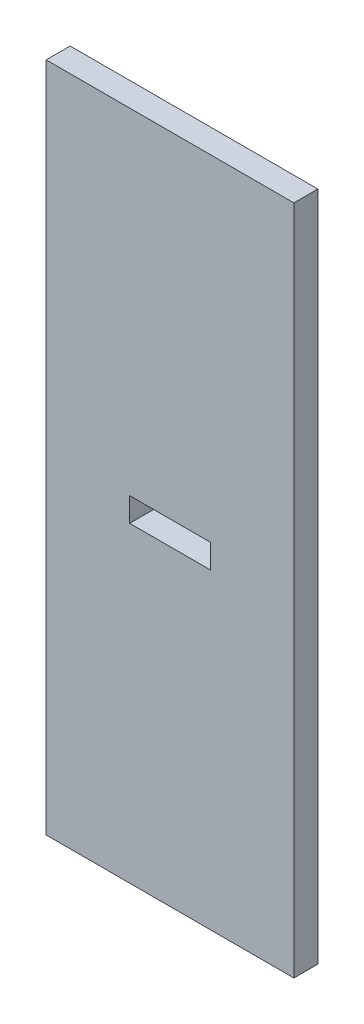
ISO-10303-21;
HEADER;
FILE_DESCRIPTION(('STEP AP214'),'2;1');
FILE_NAME('part.step','',(''),(''),'','','');
FILE_SCHEMA(('AUTOMOTIVE_DESIGN { 1 0 10303 214 1 1 1 1 }'));
ENDSEC;
DATA;
#1=APPLICATION_CONTEXT('core data for automotive mechanical design processes');
#2=APPLICATION_PROTOCOL_DEFINITION('international standard','automotive_design',2000,#1);
#3=PRODUCT_CONTEXT('',#1,'mechanical');
#4=PRODUCT('Part','Part','',(#3));
#5=PRODUCT_RELATED_PRODUCT_CATEGORY('part','',(#4));
#6=PRODUCT_DEFINITION_FORMATION('','',#4);
#7=PRODUCT_DEFINITION_CONTEXT('part definition',#1,'design');
#8=PRODUCT_DEFINITION('design','',#6,#7);
#9=PRODUCT_DEFINITION_SHAPE('','',#8);
#10=(LENGTH_UNIT() NAMED_UNIT(*) SI_UNIT(.MILLI.,.METRE.));
#11=(NAMED_UNIT(*) PLANE_ANGLE_UNIT() SI_UNIT($,.RADIAN.));
#12=(NAMED_UNIT(*) SI_UNIT($,.STERADIAN.) SOLID_ANGLE_UNIT());
#13=UNCERTAINTY_MEASURE_WITH_UNIT(LENGTH_MEASURE(1.E-05),#10,'distance_accuracy_value','');
#14=(GEOMETRIC_REPRESENTATION_CONTEXT(3) GLOBAL_UNCERTAINTY_ASSIGNED_CONTEXT((#13)) GLOBAL_UNIT_ASSIGNED_CONTEXT((#10,
#11,#12)) REPRESENTATION_CONTEXT('',''));
#15=CARTESIAN_POINT('',(0.,0.,0.));
#16=DIRECTION('',(0.,0.,1.));
#17=DIRECTION('',(1.,0.,0.));
#18=AXIS2_PLACEMENT_3D('',#15,#16,#17);
#19=CARTESIAN_POINT('',(0.,0.,3.));
#20=DIRECTION('',(0.,0.,1.));
#21=DIRECTION('',(1.,0.,0.));
#22=AXIS2_PLACEMENT_3D('',#19,#20,#21);
#23=PLANE('',#22);
#24=DIRECTION('',(1.,0.,0.));
#25=VECTOR('',#24,1.);
#26=CARTESIAN_POINT('',(0.,0.,3.));
#27=LINE('',#26,#25);
#28=CARTESIAN_POINT('',(0.,0.,3.));
#29=VERTEX_POINT('',#28);
#30=CARTESIAN_POINT('',(31.,0.,3.));
#31=VERTEX_POINT('',#30);
#32=EDGE_CURVE('E134',#29,#31,#27,.T.);
#33=ORIENTED_EDGE('',*,*,#32,.T.);
#34=DIRECTION('',(0.,1.,0.));
#35=VECTOR('',#34,1.);
#36=CARTESIAN_POINT('',(31.,0.,3.));
#37=LINE('',#36,#35);
#38=CARTESIAN_POINT('',(31.,84.,3.));
#39=VERTEX_POINT('',#38);
#40=EDGE_CURVE('E137',#31,#39,#37,.T.);
#41=ORIENTED_EDGE('',*,*,#40,.T.);
#42=DIRECTION('',(-1.,0.,0.));
#43=VECTOR('',#42,1.);
#44=CARTESIAN_POINT('',(0.,84.,3.));
#45=LINE('',#44,#43);
#46=CARTESIAN_POINT('',(0.,84.,3.));
#47=VERTEX_POINT('',#46);
#48=EDGE_CURVE('E140',#39,#47,#45,.T.);
#49=ORIENTED_EDGE('',*,*,#48,.T.);
#50=DIRECTION('',(0.,-1.,0.));
#51=VECTOR('',#50,1.);
#52=CARTESIAN_POINT('',(0.,84.,3.));
#53=LINE('',#52,#51);
#54=EDGE_CURVE('E142',#47,#29,#53,.T.);
#55=ORIENTED_EDGE('',*,*,#54,.T.);
#56=EDGE_LOOP('',(#33,#41,#49,#55));
#57=FACE_BOUND('',#56,.T.);
#58=DIRECTION('',(0.,-1.,0.));
#59=VECTOR('',#58,1.);
#60=CARTESIAN_POINT('',(10.45,42.,3.));
#61=LINE('',#60,#59);
#62=CARTESIAN_POINT('',(10.45,42.,3.));
#63=VERTEX_POINT('',#62);
#64=CARTESIAN_POINT('',(10.45,39.,3.));
#65=VERTEX_POINT('',#64);
#66=EDGE_CURVE('E106',#63,#65,#61,.T.);
#67=ORIENTED_EDGE('',*,*,#66,.F.);
#68=DIRECTION('',(-1.,0.,0.));
#69=VECTOR('',#68,1.);
#70=CARTESIAN_POINT('',(10.45,42.,3.));
#71=LINE('',#70,#69);
#72=CARTESIAN_POINT('',(20.55,42.,3.));
#73=VERTEX_POINT('',#72);
#74=EDGE_CURVE('E98',#73,#63,#71,.T.);
#75=ORIENTED_EDGE('',*,*,#74,.F.);
#76=DIRECTION('',(0.,1.,0.));
#77=VECTOR('',#76,1.);
#78=CARTESIAN_POINT('',(20.55,42.,3.));
#79=LINE('',#78,#77);
#80=CARTESIAN_POINT('',(20.55,39.,3.));
#81=VERTEX_POINT('',#80);
#82=EDGE_CURVE('E120',#81,#73,#79,.T.);
#83=ORIENTED_EDGE('',*,*,#82,.F.);
#84=DIRECTION('',(1.,0.,0.));
#85=VECTOR('',#84,1.);
#86=CARTESIAN_POINT('',(10.45,39.,3.));
#87=LINE('',#86,#85);
#88=EDGE_CURVE('E118',#65,#81,#87,.T.);
#89=ORIENTED_EDGE('',*,*,#88,.F.);
#90=EDGE_LOOP('',(#67,#75,#83,#89));
#91=FACE_BOUND('',#90,.T.);
#92=ADVANCED_FACE('F33',(#57,#91),#23,.T.);
#93=CARTESIAN_POINT('',(0.,0.,0.));
#94=DIRECTION('',(0.,0.,1.));
#95=DIRECTION('',(1.,0.,0.));
#96=AXIS2_PLACEMENT_3D('',#93,#94,#95);
#97=PLANE('',#96);
#98=DIRECTION('',(1.,0.,0.));
#99=VECTOR('',#98,1.);
#100=CARTESIAN_POINT('',(0.,0.,0.));
#101=LINE('',#100,#99);
#102=CARTESIAN_POINT('',(0.,0.,0.));
#103=VERTEX_POINT('',#102);
#104=CARTESIAN_POINT('',(31.,0.,0.));
#105=VERTEX_POINT('',#104);
#106=EDGE_CURVE('E114',#103,#105,#101,.T.);
#107=ORIENTED_EDGE('',*,*,#106,.F.);
#108=DIRECTION('',(0.,-1.,0.));
#109=VECTOR('',#108,1.);
#110=CARTESIAN_POINT('',(0.,84.,0.));
#111=LINE('',#110,#109);
#112=CARTESIAN_POINT('',(0.,84.,0.));
#113=VERTEX_POINT('',#112);
#114=EDGE_CURVE('E138',#113,#103,#111,.T.);
#115=ORIENTED_EDGE('',*,*,#114,.F.);
#116=DIRECTION('',(-1.,0.,0.));
#117=VECTOR('',#116,1.);
#118=CARTESIAN_POINT('',(0.,84.,0.));
#119=LINE('',#118,#117);
#120=CARTESIAN_POINT('',(31.,84.,0.));
#121=VERTEX_POINT('',#120);
#122=EDGE_CURVE('E149',#121,#113,#119,.T.);
#123=ORIENTED_EDGE('',*,*,#122,.F.);
#124=DIRECTION('',(0.,1.,0.));
#125=VECTOR('',#124,1.);
#126=CARTESIAN_POINT('',(31.,0.,0.));
#127=LINE('',#126,#125);
#128=EDGE_CURVE('E147',#105,#121,#127,.T.);
#129=ORIENTED_EDGE('',*,*,#128,.F.);
#130=EDGE_LOOP('',(#107,#115,#123,#129));
#131=FACE_BOUND('',#130,.T.);
#132=DIRECTION('',(-1.,0.,0.));
#133=VECTOR('',#132,1.);
#134=CARTESIAN_POINT('',(10.45,42.,0.));
#135=LINE('',#134,#133);
#136=CARTESIAN_POINT('',(20.55,42.,0.));
#137=VERTEX_POINT('',#136);
#138=CARTESIAN_POINT('',(10.45,42.,0.));
#139=VERTEX_POINT('',#138);
#140=EDGE_CURVE('E56',#137,#139,#135,.T.);
#141=ORIENTED_EDGE('',*,*,#140,.T.);
#142=DIRECTION('',(0.,-1.,0.));
#143=VECTOR('',#142,1.);
#144=CARTESIAN_POINT('',(10.45,42.,0.));
#145=LINE('',#144,#143);
#146=CARTESIAN_POINT('',(10.45,39.,0.));
#147=VERTEX_POINT('',#146);
#148=EDGE_CURVE('E113',#139,#147,#145,.T.);
#149=ORIENTED_EDGE('',*,*,#148,.T.);
#150=DIRECTION('',(1.,0.,0.));
#151=VECTOR('',#150,1.);
#152=CARTESIAN_POINT('',(10.45,39.,0.));
#153=LINE('',#152,#151);
#154=CARTESIAN_POINT('',(20.55,39.,0.));
#155=VERTEX_POINT('',#154);
#156=EDGE_CURVE('E126',#147,#155,#153,.T.);
#157=ORIENTED_EDGE('',*,*,#156,.T.);
#158=DIRECTION('',(0.,1.,0.));
#159=VECTOR('',#158,1.);
#160=CARTESIAN_POINT('',(20.55,42.,0.));
#161=LINE('',#160,#159);
#162=EDGE_CURVE('E107',#155,#137,#161,.T.);
#163=ORIENTED_EDGE('',*,*,#162,.T.);
#164=EDGE_LOOP('',(#141,#149,#157,#163));
#165=FACE_BOUND('',#164,.T.);
#166=ADVANCED_FACE('F167',(#131,#165),#97,.F.);
#167=CARTESIAN_POINT('',(0.,0.,3.));
#168=DIRECTION('',(0.,1.,0.));
#169=DIRECTION('',(0.,0.,1.));
#170=AXIS2_PLACEMENT_3D('',#167,#168,#169);
#171=PLANE('',#170);
#172=ORIENTED_EDGE('',*,*,#106,.T.);
#173=DIRECTION('',(0.,0.,-1.));
#174=VECTOR('',#173,1.);
#175=CARTESIAN_POINT('',(31.,0.,3.));
#176=LINE('',#175,#174);
#177=EDGE_CURVE('E11',#31,#105,#176,.T.);
#178=ORIENTED_EDGE('',*,*,#177,.F.);
#179=ORIENTED_EDGE('',*,*,#32,.F.);
#180=DIRECTION('',(0.,0.,-1.));
#181=VECTOR('',#180,1.);
#182=CARTESIAN_POINT('',(0.,0.,3.));
#183=LINE('',#182,#181);
#184=EDGE_CURVE('E144',#29,#103,#183,.T.);
#185=ORIENTED_EDGE('',*,*,#184,.T.);
#186=EDGE_LOOP('',(#172,#178,#179,#185));
#187=FACE_BOUND('',#186,.T.);
#188=ADVANCED_FACE('F35',(#187),#171,.F.);
#189=CARTESIAN_POINT('',(31.,0.,3.));
#190=DIRECTION('',(-1.,0.,0.));
#191=DIRECTION('',(0.,-1.,0.));
#192=AXIS2_PLACEMENT_3D('',#189,#190,#191);
#193=PLANE('',#192);
#194=ORIENTED_EDGE('',*,*,#128,.T.);
#195=DIRECTION('',(0.,0.,-1.));
#196=VECTOR('',#195,1.);
#197=CARTESIAN_POINT('',(31.,84.,3.));
#198=LINE('',#197,#196);
#199=EDGE_CURVE('E41',#39,#121,#198,.T.);
#200=ORIENTED_EDGE('',*,*,#199,.F.);
#201=ORIENTED_EDGE('',*,*,#40,.F.);
#202=ORIENTED_EDGE('',*,*,#177,.T.);
#203=EDGE_LOOP('',(#194,#200,#201,#202));
#204=FACE_BOUND('',#203,.T.);
#205=ADVANCED_FACE('F177',(#204),#193,.F.);
#206=CARTESIAN_POINT('',(0.,84.,3.));
#207=DIRECTION('',(0.,-1.,0.));
#208=DIRECTION('',(0.,0.,-1.));
#209=AXIS2_PLACEMENT_3D('',#206,#207,#208);
#210=PLANE('',#209);
#211=ORIENTED_EDGE('',*,*,#122,.T.);
#212=DIRECTION('',(0.,0.,-1.));
#213=VECTOR('',#212,1.);
#214=CARTESIAN_POINT('',(0.,84.,3.));
#215=LINE('',#214,#213);
#216=EDGE_CURVE('E154',#47,#113,#215,.T.);
#217=ORIENTED_EDGE('',*,*,#216,.F.);
#218=ORIENTED_EDGE('',*,*,#48,.F.);
#219=ORIENTED_EDGE('',*,*,#199,.T.);
#220=EDGE_LOOP('',(#211,#217,#218,#219));
#221=FACE_BOUND('',#220,.T.);
#222=ADVANCED_FACE('F161',(#221),#210,.F.);
#223=CARTESIAN_POINT('',(0.,84.,3.));
#224=DIRECTION('',(1.,0.,0.));
#225=DIRECTION('',(0.,1.,0.));
#226=AXIS2_PLACEMENT_3D('',#223,#224,#225);
#227=PLANE('',#226);
#228=ORIENTED_EDGE('',*,*,#114,.T.);
#229=ORIENTED_EDGE('',*,*,#184,.F.);
#230=ORIENTED_EDGE('',*,*,#54,.F.);
#231=ORIENTED_EDGE('',*,*,#216,.T.);
#232=EDGE_LOOP('',(#228,#229,#230,#231));
#233=FACE_BOUND('',#232,.T.);
#234=ADVANCED_FACE('F171',(#233),#227,.F.);
#235=CARTESIAN_POINT('',(10.45,42.,3.));
#236=DIRECTION('',(0.,-1.,0.));
#237=DIRECTION('',(0.,0.,-1.));
#238=AXIS2_PLACEMENT_3D('',#235,#236,#237);
#239=PLANE('',#238);
#240=ORIENTED_EDGE('',*,*,#140,.F.);
#241=DIRECTION('',(0.,0.,-1.));
#242=VECTOR('',#241,1.);
#243=CARTESIAN_POINT('',(20.55,42.,3.));
#244=LINE('',#243,#242);
#245=EDGE_CURVE('E102',#73,#137,#244,.T.);
#246=ORIENTED_EDGE('',*,*,#245,.F.);
#247=ORIENTED_EDGE('',*,*,#74,.T.);
#248=DIRECTION('',(0.,0.,-1.));
#249=VECTOR('',#248,1.);
#250=CARTESIAN_POINT('',(10.45,42.,3.));
#251=LINE('',#250,#249);
#252=EDGE_CURVE('E101',#63,#139,#251,.T.);
#253=ORIENTED_EDGE('',*,*,#252,.T.);
#254=EDGE_LOOP('',(#240,#246,#247,#253));
#255=FACE_BOUND('',#254,.T.);
#256=ADVANCED_FACE('F100',(#255),#239,.T.);
#257=CARTESIAN_POINT('',(10.45,42.,3.));
#258=DIRECTION('',(1.,0.,0.));
#259=DIRECTION('',(0.,1.,0.));
#260=AXIS2_PLACEMENT_3D('',#257,#258,#259);
#261=PLANE('',#260);
#262=ORIENTED_EDGE('',*,*,#148,.F.);
#263=ORIENTED_EDGE('',*,*,#252,.F.);
#264=ORIENTED_EDGE('',*,*,#66,.T.);
#265=DIRECTION('',(0.,0.,-1.));
#266=VECTOR('',#265,1.);
#267=CARTESIAN_POINT('',(10.45,39.,3.));
#268=LINE('',#267,#266);
#269=EDGE_CURVE('E115',#65,#147,#268,.T.);
#270=ORIENTED_EDGE('',*,*,#269,.T.);
#271=EDGE_LOOP('',(#262,#263,#264,#270));
#272=FACE_BOUND('',#271,.T.);
#273=ADVANCED_FACE('F110',(#272),#261,.T.);
#274=CARTESIAN_POINT('',(10.45,39.,3.));
#275=DIRECTION('',(0.,1.,0.));
#276=DIRECTION('',(0.,0.,1.));
#277=AXIS2_PLACEMENT_3D('',#274,#275,#276);
#278=PLANE('',#277);
#279=ORIENTED_EDGE('',*,*,#156,.F.);
#280=ORIENTED_EDGE('',*,*,#269,.F.);
#281=ORIENTED_EDGE('',*,*,#88,.T.);
#282=DIRECTION('',(0.,0.,-1.));
#283=VECTOR('',#282,1.);
#284=CARTESIAN_POINT('',(20.55,39.,3.));
#285=LINE('',#284,#283);
#286=EDGE_CURVE('E48',#81,#155,#285,.T.);
#287=ORIENTED_EDGE('',*,*,#286,.T.);
#288=EDGE_LOOP('',(#279,#280,#281,#287));
#289=FACE_BOUND('',#288,.T.);
#290=ADVANCED_FACE('F200',(#289),#278,.T.);
#291=CARTESIAN_POINT('',(20.55,42.,3.));
#292=DIRECTION('',(-1.,0.,0.));
#293=DIRECTION('',(0.,0.,1.));
#294=AXIS2_PLACEMENT_3D('',#291,#292,#293);
#295=PLANE('',#294);
#296=ORIENTED_EDGE('',*,*,#162,.F.);
#297=ORIENTED_EDGE('',*,*,#286,.F.);
#298=ORIENTED_EDGE('',*,*,#82,.T.);
#299=ORIENTED_EDGE('',*,*,#245,.T.);
#300=EDGE_LOOP('',(#296,#297,#298,#299));
#301=FACE_BOUND('',#300,.T.);
#302=ADVANCED_FACE('F204',(#301),#295,.T.);
#303=CLOSED_SHELL('',(#92,#166,#188,#205,#222,#234,#256,#273,#290,#302));
#304=MANIFOLD_SOLID_BREP('B2',#303);
#305=ADVANCED_BREP_SHAPE_REPRESENTATION('',(#18,#304),#14);
#306=SHAPE_DEFINITION_REPRESENTATION(#9,#305);
ENDSEC;
END-ISO-10303-21;
